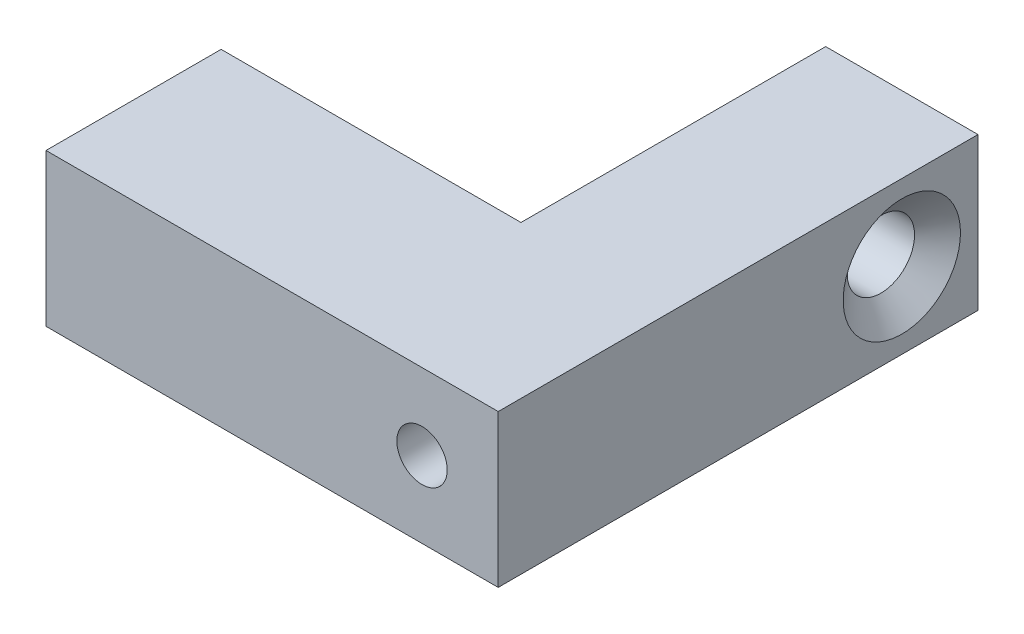
ISO-10303-21;
HEADER;
FILE_DESCRIPTION(('STEP AP214'),'2;1');
FILE_NAME('part.step','',(''),(''),'','','');
FILE_SCHEMA(('AUTOMOTIVE_DESIGN { 1 0 10303 214 1 1 1 1 }'));
ENDSEC;
DATA;
#1=APPLICATION_CONTEXT('core data for automotive mechanical design processes');
#2=APPLICATION_PROTOCOL_DEFINITION('international standard','automotive_design',2000,#1);
#3=PRODUCT_CONTEXT('',#1,'mechanical');
#4=PRODUCT('Part','Part','',(#3));
#5=PRODUCT_RELATED_PRODUCT_CATEGORY('part','',(#4));
#6=PRODUCT_DEFINITION_FORMATION('','',#4);
#7=PRODUCT_DEFINITION_CONTEXT('part definition',#1,'design');
#8=PRODUCT_DEFINITION('design','',#6,#7);
#9=PRODUCT_DEFINITION_SHAPE('','',#8);
#10=(LENGTH_UNIT() NAMED_UNIT(*) SI_UNIT(.MILLI.,.METRE.));
#11=(NAMED_UNIT(*) PLANE_ANGLE_UNIT() SI_UNIT($,.RADIAN.));
#12=(NAMED_UNIT(*) SI_UNIT($,.STERADIAN.) SOLID_ANGLE_UNIT());
#13=UNCERTAINTY_MEASURE_WITH_UNIT(LENGTH_MEASURE(1.E-05),#10,'distance_accuracy_value','');
#14=(GEOMETRIC_REPRESENTATION_CONTEXT(3) GLOBAL_UNCERTAINTY_ASSIGNED_CONTEXT((#13)) GLOBAL_UNIT_ASSIGNED_CONTEXT((#10,
#11,#12)) REPRESENTATION_CONTEXT('',''));
#15=CARTESIAN_POINT('',(0.,0.,0.));
#16=DIRECTION('',(0.,0.,1.));
#17=DIRECTION('',(1.,0.,0.));
#18=AXIS2_PLACEMENT_3D('',#15,#16,#17);
#19=CARTESIAN_POINT('',(-11.3775510204082,12.7,-11.3265306122449));
#20=DIRECTION('',(1.,0.,0.));
#21=DIRECTION('',(0.,0.,-1.));
#22=AXIS2_PLACEMENT_3D('',#19,#20,#21);
#23=PLANE('',#22);
#24=CARTESIAN_POINT('',(-11.3775510204082,6.35,-4.9765306122449));
#25=DIRECTION('',(1.,0.,0.));
#26=DIRECTION('',(0.,0.,-1.));
#27=AXIS2_PLACEMENT_3D('',#24,#25,#26);
#28=CIRCLE('',#27,2.8067);
#29=CARTESIAN_POINT('',(-11.3775510204082,6.35,-7.78323061224489));
#30=VERTEX_POINT('',#29);
#31=EDGE_CURVE('E156',#30,#30,#28,.T.);
#32=ORIENTED_EDGE('',*,*,#31,.T.);
#33=EDGE_LOOP('',(#32));
#34=FACE_BOUND('',#33,.T.);
#35=DIRECTION('',(0.,-1.,0.));
#36=VECTOR('',#35,1.);
#37=CARTESIAN_POINT('',(-11.3775510204082,0.,14.0734693877551));
#38=LINE('',#37,#36);
#39=CARTESIAN_POINT('',(-11.3775510204082,12.7,14.0734693877551));
#40=VERTEX_POINT('',#39);
#41=CARTESIAN_POINT('',(-11.3775510204082,0.,14.0734693877551));
#42=VERTEX_POINT('',#41);
#43=EDGE_CURVE('E54',#40,#42,#38,.T.);
#44=ORIENTED_EDGE('',*,*,#43,.F.);
#45=DIRECTION('',(0.,0.,1.));
#46=VECTOR('',#45,1.);
#47=CARTESIAN_POINT('',(-11.3775510204082,12.7,-11.3265306122449));
#48=LINE('',#47,#46);
#49=CARTESIAN_POINT('',(-11.3775510204082,12.7,-11.3265306122449));
#50=VERTEX_POINT('',#49);
#51=EDGE_CURVE('E109',#50,#40,#48,.T.);
#52=ORIENTED_EDGE('',*,*,#51,.F.);
#53=DIRECTION('',(0.,-1.,0.));
#54=VECTOR('',#53,1.);
#55=CARTESIAN_POINT('',(-11.3775510204082,12.7,-11.3265306122449));
#56=LINE('',#55,#54);
#57=CARTESIAN_POINT('',(-11.3775510204082,0.,-11.3265306122449));
#58=VERTEX_POINT('',#57);
#59=EDGE_CURVE('E167',#50,#58,#56,.T.);
#60=ORIENTED_EDGE('',*,*,#59,.T.);
#61=DIRECTION('',(0.,0.,1.));
#62=VECTOR('',#61,1.);
#63=CARTESIAN_POINT('',(-11.3775510204082,0.,-11.3265306122449));
#64=LINE('',#63,#62);
#65=EDGE_CURVE('E160',#58,#42,#64,.T.);
#66=ORIENTED_EDGE('',*,*,#65,.T.);
#67=EDGE_LOOP('',(#44,#52,#60,#66));
#68=FACE_BOUND('',#67,.T.);
#69=ADVANCED_FACE('F39',(#34,#68),#23,.F.);
#70=CARTESIAN_POINT('',(-11.3775510204082,12.7,28.6734693877551));
#71=DIRECTION('',(0.,0.,-1.));
#72=DIRECTION('',(-1.,0.,0.));
#73=AXIS2_PLACEMENT_3D('',#70,#71,#72);
#74=PLANE('',#73);
#75=CARTESIAN_POINT('',(-5.02755102040815,6.35,28.6734693877551));
#76=DIRECTION('',(0.,0.,1.));
#77=DIRECTION('',(1.,0.,0.));
#78=AXIS2_PLACEMENT_3D('',#75,#76,#77);
#79=CIRCLE('',#78,2.1);
#80=CARTESIAN_POINT('',(-2.92755102040816,6.35,28.6734693877551));
#81=VERTEX_POINT('',#80);
#82=EDGE_CURVE('E140',#81,#81,#79,.T.);
#83=ORIENTED_EDGE('',*,*,#82,.F.);
#84=EDGE_LOOP('',(#83));
#85=FACE_BOUND('',#84,.T.);
#86=DIRECTION('',(1.,0.,0.));
#87=VECTOR('',#86,1.);
#88=CARTESIAN_POINT('',(-11.3775510204082,0.,28.6734693877551));
#89=LINE('',#88,#87);
#90=CARTESIAN_POINT('',(-36.3775510204082,0.,28.6734693877551));
#91=VERTEX_POINT('',#90);
#92=CARTESIAN_POINT('',(1.32244897959185,0.,28.6734693877551));
#93=VERTEX_POINT('',#92);
#94=EDGE_CURVE('E170',#91,#93,#89,.T.);
#95=ORIENTED_EDGE('',*,*,#94,.T.);
#96=DIRECTION('',(0.,-1.,0.));
#97=VECTOR('',#96,1.);
#98=CARTESIAN_POINT('',(1.32244897959185,12.7,28.6734693877551));
#99=LINE('',#98,#97);
#100=CARTESIAN_POINT('',(1.32244897959185,12.7,28.6734693877551));
#101=VERTEX_POINT('',#100);
#102=EDGE_CURVE('E11',#101,#93,#99,.T.);
#103=ORIENTED_EDGE('',*,*,#102,.F.);
#104=DIRECTION('',(1.,0.,0.));
#105=VECTOR('',#104,1.);
#106=CARTESIAN_POINT('',(-11.3775510204082,12.7,28.6734693877551));
#107=LINE('',#106,#105);
#108=CARTESIAN_POINT('',(-36.3775510204082,12.7,28.6734693877551));
#109=VERTEX_POINT('',#108);
#110=EDGE_CURVE('E84',#109,#101,#107,.T.);
#111=ORIENTED_EDGE('',*,*,#110,.F.);
#112=DIRECTION('',(0.,1.,0.));
#113=VECTOR('',#112,1.);
#114=CARTESIAN_POINT('',(-36.3775510204082,0.,28.6734693877551));
#115=LINE('',#114,#113);
#116=EDGE_CURVE('E105',#91,#109,#115,.T.);
#117=ORIENTED_EDGE('',*,*,#116,.F.);
#118=EDGE_LOOP('',(#95,#103,#111,#117));
#119=FACE_BOUND('',#118,.T.);
#120=ADVANCED_FACE('F103',(#85,#119),#74,.F.);
#121=CARTESIAN_POINT('',(1.32244897959184,12.7,-11.3265306122449));
#122=DIRECTION('',(-1.,0.,0.));
#123=DIRECTION('',(0.,0.,1.));
#124=AXIS2_PLACEMENT_3D('',#121,#122,#123);
#125=PLANE('',#124);
#126=CARTESIAN_POINT('',(1.32244897959184,6.35,-4.9765306122449));
#127=DIRECTION('',(1.,0.,0.));
#128=DIRECTION('',(0.,0.,-1.));
#129=AXIS2_PLACEMENT_3D('',#126,#127,#128);
#130=CIRCLE('',#129,4.8895);
#131=CARTESIAN_POINT('',(1.32244897959184,6.35,-9.8660306122449));
#132=VERTEX_POINT('',#131);
#133=EDGE_CURVE('E148',#132,#132,#130,.T.);
#134=ORIENTED_EDGE('',*,*,#133,.F.);
#135=EDGE_LOOP('',(#134));
#136=FACE_BOUND('',#135,.T.);
#137=DIRECTION('',(0.,0.,-1.));
#138=VECTOR('',#137,1.);
#139=CARTESIAN_POINT('',(1.32244897959184,0.,-11.3265306122449));
#140=LINE('',#139,#138);
#141=CARTESIAN_POINT('',(1.32244897959184,0.,-11.3265306122449));
#142=VERTEX_POINT('',#141);
#143=EDGE_CURVE('E173',#93,#142,#140,.T.);
#144=ORIENTED_EDGE('',*,*,#143,.T.);
#145=DIRECTION('',(0.,-1.,0.));
#146=VECTOR('',#145,1.);
#147=CARTESIAN_POINT('',(1.32244897959184,12.7,-11.3265306122449));
#148=LINE('',#147,#146);
#149=CARTESIAN_POINT('',(1.32244897959184,12.7,-11.3265306122449));
#150=VERTEX_POINT('',#149);
#151=EDGE_CURVE('E47',#150,#142,#148,.T.);
#152=ORIENTED_EDGE('',*,*,#151,.F.);
#153=DIRECTION('',(0.,0.,-1.));
#154=VECTOR('',#153,1.);
#155=CARTESIAN_POINT('',(1.32244897959184,12.7,-11.3265306122449));
#156=LINE('',#155,#154);
#157=EDGE_CURVE('E108',#101,#150,#156,.T.);
#158=ORIENTED_EDGE('',*,*,#157,.F.);
#159=ORIENTED_EDGE('',*,*,#102,.T.);
#160=EDGE_LOOP('',(#144,#152,#158,#159));
#161=FACE_BOUND('',#160,.T.);
#162=ADVANCED_FACE('F190',(#136,#161),#125,.F.);
#163=CARTESIAN_POINT('',(-11.3775510204082,12.7,-11.3265306122449));
#164=DIRECTION('',(0.,0.,1.));
#165=DIRECTION('',(1.,0.,0.));
#166=AXIS2_PLACEMENT_3D('',#163,#164,#165);
#167=PLANE('',#166);
#168=DIRECTION('',(-1.,0.,0.));
#169=VECTOR('',#168,1.);
#170=CARTESIAN_POINT('',(-11.3775510204082,0.,-11.3265306122449));
#171=LINE('',#170,#169);
#172=EDGE_CURVE('E79',#142,#58,#171,.T.);
#173=ORIENTED_EDGE('',*,*,#172,.T.);
#174=ORIENTED_EDGE('',*,*,#59,.F.);
#175=DIRECTION('',(-1.,0.,0.));
#176=VECTOR('',#175,1.);
#177=CARTESIAN_POINT('',(-11.3775510204082,12.7,-11.3265306122449));
#178=LINE('',#177,#176);
#179=EDGE_CURVE('E62',#150,#50,#178,.T.);
#180=ORIENTED_EDGE('',*,*,#179,.F.);
#181=ORIENTED_EDGE('',*,*,#151,.T.);
#182=EDGE_LOOP('',(#173,#174,#180,#181));
#183=FACE_BOUND('',#182,.T.);
#184=ADVANCED_FACE('F181',(#183),#167,.F.);
#185=CARTESIAN_POINT('',(0.,12.7,0.));
#186=DIRECTION('',(0.,1.,0.));
#187=DIRECTION('',(0.,0.,1.));
#188=AXIS2_PLACEMENT_3D('',#185,#186,#187);
#189=PLANE('',#188);
#190=ORIENTED_EDGE('',*,*,#51,.T.);
#191=DIRECTION('',(1.,0.,0.));
#192=VECTOR('',#191,1.);
#193=CARTESIAN_POINT('',(-36.3775510204082,12.7,14.0734693877551));
#194=LINE('',#193,#192);
#195=CARTESIAN_POINT('',(-36.3775510204082,12.7,14.0734693877551));
#196=VERTEX_POINT('',#195);
#197=EDGE_CURVE('E115',#196,#40,#194,.T.);
#198=ORIENTED_EDGE('',*,*,#197,.F.);
#199=DIRECTION('',(0.,0.,-1.));
#200=VECTOR('',#199,1.);
#201=CARTESIAN_POINT('',(-36.3775510204082,12.7,28.6734693877551));
#202=LINE('',#201,#200);
#203=EDGE_CURVE('E112',#109,#196,#202,.T.);
#204=ORIENTED_EDGE('',*,*,#203,.F.);
#205=ORIENTED_EDGE('',*,*,#110,.T.);
#206=ORIENTED_EDGE('',*,*,#157,.T.);
#207=ORIENTED_EDGE('',*,*,#179,.T.);
#208=EDGE_LOOP('',(#190,#198,#204,#205,#206,#207));
#209=FACE_BOUND('',#208,.T.);
#210=ADVANCED_FACE('F113',(#209),#189,.T.);
#211=CARTESIAN_POINT('',(0.,0.,0.));
#212=DIRECTION('',(0.,1.,0.));
#213=DIRECTION('',(0.,0.,1.));
#214=AXIS2_PLACEMENT_3D('',#211,#212,#213);
#215=PLANE('',#214);
#216=ORIENTED_EDGE('',*,*,#65,.F.);
#217=ORIENTED_EDGE('',*,*,#172,.F.);
#218=ORIENTED_EDGE('',*,*,#143,.F.);
#219=ORIENTED_EDGE('',*,*,#94,.F.);
#220=DIRECTION('',(0.,0.,1.));
#221=VECTOR('',#220,1.);
#222=CARTESIAN_POINT('',(-36.3775510204082,0.,28.6734693877551));
#223=LINE('',#222,#221);
#224=CARTESIAN_POINT('',(-36.3775510204082,0.,14.0734693877551));
#225=VERTEX_POINT('',#224);
#226=EDGE_CURVE('E124',#225,#91,#223,.T.);
#227=ORIENTED_EDGE('',*,*,#226,.F.);
#228=DIRECTION('',(1.,0.,0.));
#229=VECTOR('',#228,1.);
#230=CARTESIAN_POINT('',(-36.3775510204082,0.,14.0734693877551));
#231=LINE('',#230,#229);
#232=EDGE_CURVE('E133',#225,#42,#231,.T.);
#233=ORIENTED_EDGE('',*,*,#232,.T.);
#234=EDGE_LOOP('',(#216,#217,#218,#219,#227,#233));
#235=FACE_BOUND('',#234,.T.);
#236=ADVANCED_FACE('F186',(#235),#215,.F.);
#237=CARTESIAN_POINT('',(1.32244897959184,6.35,-4.9765306122449));
#238=DIRECTION('',(1.,0.,0.));
#239=DIRECTION('',(0.,0.,-1.));
#240=AXIS2_PLACEMENT_3D('',#237,#238,#239);
#241=CYLINDRICAL_SURFACE('',#240,2.8067);
#242=ORIENTED_EDGE('',*,*,#31,.F.);
#243=EDGE_LOOP('',(#242));
#244=FACE_BOUND('',#243,.T.);
#245=CARTESIAN_POINT('',(-0.425227732224199,6.35,-4.9765306122449));
#246=DIRECTION('',(1.,0.,0.));
#247=DIRECTION('',(0.,0.,-1.));
#248=AXIS2_PLACEMENT_3D('',#245,#246,#247);
#249=CIRCLE('',#248,2.8067);
#250=CARTESIAN_POINT('',(-0.4252277322242,6.35,-7.7832306122449));
#251=VERTEX_POINT('',#250);
#252=EDGE_CURVE('E152',#251,#251,#249,.T.);
#253=ORIENTED_EDGE('',*,*,#252,.T.);
#254=EDGE_LOOP('',(#253));
#255=FACE_BOUND('',#254,.T.);
#256=ADVANCED_FACE('F209',(#244,#255),#241,.F.);
#257=CARTESIAN_POINT('',(1.32244897959184,6.35,-4.9765306122449));
#258=DIRECTION('',(1.,0.,0.));
#259=DIRECTION('',(0.,0.,-1.));
#260=AXIS2_PLACEMENT_3D('',#257,#258,#259);
#261=CONICAL_SURFACE('',#260,4.8895,0.872664625997164);
#262=ORIENTED_EDGE('',*,*,#252,.F.);
#263=EDGE_LOOP('',(#262));
#264=FACE_BOUND('',#263,.T.);
#265=ORIENTED_EDGE('',*,*,#133,.T.);
#266=EDGE_LOOP('',(#265));
#267=FACE_BOUND('',#266,.T.);
#268=ADVANCED_FACE('F212',(#264,#267),#261,.F.);
#269=CARTESIAN_POINT('',(-5.02755102040815,6.35,15.9734693877551));
#270=DIRECTION('',(0.,0.,1.));
#271=DIRECTION('',(1.,0.,0.));
#272=AXIS2_PLACEMENT_3D('',#269,#270,#271);
#273=CONICAL_SURFACE('',#272,2.1,1.02974425867665);
#274=CARTESIAN_POINT('',(-5.02755102040816,6.35,14.7116620877972));
#275=VERTEX_POINT('',#274);
#276=VERTEX_LOOP('',#275);
#277=FACE_BOUND('',#276,.T.);
#278=CARTESIAN_POINT('',(-5.02755102040815,6.35,15.9734693877551));
#279=DIRECTION('',(0.,0.,1.));
#280=DIRECTION('',(1.,0.,0.));
#281=AXIS2_PLACEMENT_3D('',#278,#279,#280);
#282=CIRCLE('',#281,2.1);
#283=CARTESIAN_POINT('',(-2.92755102040816,6.35,15.9734693877551));
#284=VERTEX_POINT('',#283);
#285=EDGE_CURVE('E144',#284,#284,#282,.T.);
#286=ORIENTED_EDGE('',*,*,#285,.T.);
#287=EDGE_LOOP('',(#286));
#288=FACE_BOUND('',#287,.T.);
#289=ADVANCED_FACE('F218',(#277,#288),#273,.F.);
#290=CARTESIAN_POINT('',(-5.02755102040815,6.35,28.6734693877551));
#291=DIRECTION('',(0.,0.,1.));
#292=DIRECTION('',(1.,0.,0.));
#293=AXIS2_PLACEMENT_3D('',#290,#291,#292);
#294=CYLINDRICAL_SURFACE('',#293,2.1);
#295=ORIENTED_EDGE('',*,*,#285,.F.);
#296=EDGE_LOOP('',(#295));
#297=FACE_BOUND('',#296,.T.);
#298=ORIENTED_EDGE('',*,*,#82,.T.);
#299=EDGE_LOOP('',(#298));
#300=FACE_BOUND('',#299,.T.);
#301=ADVANCED_FACE('F223',(#297,#300),#294,.F.);
#302=CARTESIAN_POINT('',(-36.3775510204082,0.,14.0734693877551));
#303=DIRECTION('',(0.,0.,1.));
#304=DIRECTION('',(1.,0.,0.));
#305=AXIS2_PLACEMENT_3D('',#302,#303,#304);
#306=PLANE('',#305);
#307=ORIENTED_EDGE('',*,*,#43,.T.);
#308=ORIENTED_EDGE('',*,*,#232,.F.);
#309=DIRECTION('',(0.,-1.,0.));
#310=VECTOR('',#309,1.);
#311=CARTESIAN_POINT('',(-36.3775510204082,0.,14.0734693877551));
#312=LINE('',#311,#310);
#313=EDGE_CURVE('E119',#196,#225,#312,.T.);
#314=ORIENTED_EDGE('',*,*,#313,.F.);
#315=ORIENTED_EDGE('',*,*,#197,.T.);
#316=EDGE_LOOP('',(#307,#308,#314,#315));
#317=FACE_BOUND('',#316,.T.);
#318=ADVANCED_FACE('F189',(#317),#306,.F.);
#319=CARTESIAN_POINT('',(-36.3775510204082,0.,0.));
#320=DIRECTION('',(-1.,0.,0.));
#321=DIRECTION('',(0.,0.,1.));
#322=AXIS2_PLACEMENT_3D('',#319,#320,#321);
#323=PLANE('',#322);
#324=ORIENTED_EDGE('',*,*,#116,.T.);
#325=ORIENTED_EDGE('',*,*,#203,.T.);
#326=ORIENTED_EDGE('',*,*,#313,.T.);
#327=ORIENTED_EDGE('',*,*,#226,.T.);
#328=EDGE_LOOP('',(#324,#325,#326,#327));
#329=FACE_BOUND('',#328,.T.);
#330=ADVANCED_FACE('F122',(#329),#323,.T.);
#331=CLOSED_SHELL('',(#69,#120,#162,#184,#210,#236,#256,#268,#289,#301,#318,#330));
#332=MANIFOLD_SOLID_BREP('B2',#331);
#333=ADVANCED_BREP_SHAPE_REPRESENTATION('',(#18,#332),#14);
#334=SHAPE_DEFINITION_REPRESENTATION(#9,#333);
ENDSEC;
END-ISO-10303-21;
